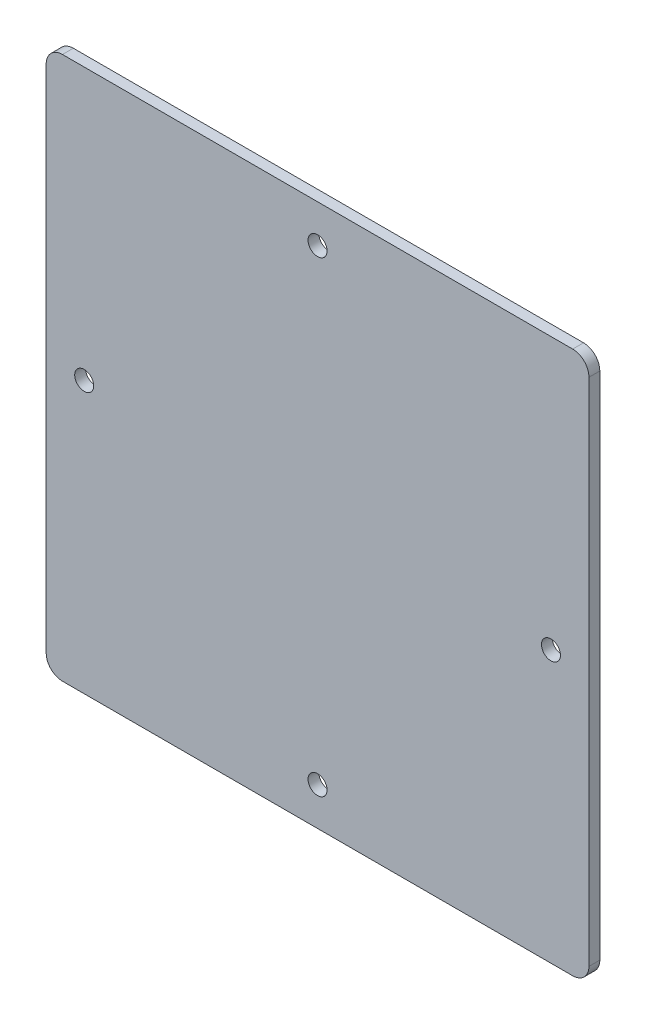
ISO-10303-21;
HEADER;
FILE_DESCRIPTION(('STEP AP214'),'2;1');
FILE_NAME('part.step','',(''),(''),'','','');
FILE_SCHEMA(('AUTOMOTIVE_DESIGN { 1 0 10303 214 1 1 1 1 }'));
ENDSEC;
DATA;
#1=APPLICATION_CONTEXT('core data for automotive mechanical design processes');
#2=APPLICATION_PROTOCOL_DEFINITION('international standard','automotive_design',2000,#1);
#3=PRODUCT_CONTEXT('',#1,'mechanical');
#4=PRODUCT('Part','Part','',(#3));
#5=PRODUCT_RELATED_PRODUCT_CATEGORY('part','',(#4));
#6=PRODUCT_DEFINITION_FORMATION('','',#4);
#7=PRODUCT_DEFINITION_CONTEXT('part definition',#1,'design');
#8=PRODUCT_DEFINITION('design','',#6,#7);
#9=PRODUCT_DEFINITION_SHAPE('','',#8);
#10=(LENGTH_UNIT() NAMED_UNIT(*) SI_UNIT(.MILLI.,.METRE.));
#11=(NAMED_UNIT(*) PLANE_ANGLE_UNIT() SI_UNIT($,.RADIAN.));
#12=(NAMED_UNIT(*) SI_UNIT($,.STERADIAN.) SOLID_ANGLE_UNIT());
#13=UNCERTAINTY_MEASURE_WITH_UNIT(LENGTH_MEASURE(1.E-05),#10,'distance_accuracy_value','');
#14=(GEOMETRIC_REPRESENTATION_CONTEXT(3) GLOBAL_UNCERTAINTY_ASSIGNED_CONTEXT((#13)) GLOBAL_UNIT_ASSIGNED_CONTEXT((#10,
#11,#12)) REPRESENTATION_CONTEXT('',''));
#15=CARTESIAN_POINT('',(0.,0.,0.));
#16=DIRECTION('',(0.,0.,1.));
#17=DIRECTION('',(1.,0.,0.));
#18=AXIS2_PLACEMENT_3D('',#15,#16,#17);
#19=CARTESIAN_POINT('',(-47.,-47.,2.));
#20=DIRECTION('',(0.,0.,1.));
#21=DIRECTION('',(1.,0.,0.));
#22=AXIS2_PLACEMENT_3D('',#19,#20,#21);
#23=PLANE('',#22);
#24=CARTESIAN_POINT('',(43.,0.,2.));
#25=DIRECTION('',(0.,0.,1.));
#26=DIRECTION('',(1.,0.,0.));
#27=AXIS2_PLACEMENT_3D('',#24,#25,#26);
#28=CIRCLE('',#27,1.75);
#29=CARTESIAN_POINT('',(44.75,0.,2.));
#30=VERTEX_POINT('',#29);
#31=EDGE_CURVE('E187',#30,#30,#28,.T.);
#32=ORIENTED_EDGE('',*,*,#31,.F.);
#33=EDGE_LOOP('',(#32));
#34=FACE_BOUND('',#33,.T.);
#35=CARTESIAN_POINT('',(-43.,0.,2.));
#36=DIRECTION('',(0.,0.,1.));
#37=DIRECTION('',(1.,0.,0.));
#38=AXIS2_PLACEMENT_3D('',#35,#36,#37);
#39=CIRCLE('',#38,1.75);
#40=CARTESIAN_POINT('',(-41.25,0.,2.));
#41=VERTEX_POINT('',#40);
#42=EDGE_CURVE('E133',#41,#41,#39,.T.);
#43=ORIENTED_EDGE('',*,*,#42,.F.);
#44=EDGE_LOOP('',(#43));
#45=FACE_BOUND('',#44,.T.);
#46=CARTESIAN_POINT('',(-47.,-47.,2.));
#47=DIRECTION('',(0.,0.,1.));
#48=DIRECTION('',(1.,0.,0.));
#49=AXIS2_PLACEMENT_3D('',#46,#47,#48);
#50=CIRCLE('',#49,3.);
#51=CARTESIAN_POINT('',(-50.,-47.,2.));
#52=VERTEX_POINT('',#51);
#53=CARTESIAN_POINT('',(-47.,-50.,2.));
#54=VERTEX_POINT('',#53);
#55=EDGE_CURVE('E144',#52,#54,#50,.T.);
#56=ORIENTED_EDGE('',*,*,#55,.T.);
#57=DIRECTION('',(1.,0.,0.));
#58=VECTOR('',#57,1.);
#59=CARTESIAN_POINT('',(-47.,-50.,2.));
#60=LINE('',#59,#58);
#61=CARTESIAN_POINT('',(47.,-50.,2.));
#62=VERTEX_POINT('',#61);
#63=EDGE_CURVE('E92',#54,#62,#60,.T.);
#64=ORIENTED_EDGE('',*,*,#63,.T.);
#65=CARTESIAN_POINT('',(47.,-47.,2.));
#66=DIRECTION('',(0.,0.,1.));
#67=DIRECTION('',(1.,0.,0.));
#68=AXIS2_PLACEMENT_3D('',#65,#66,#67);
#69=CIRCLE('',#68,3.);
#70=CARTESIAN_POINT('',(50.,-47.,2.));
#71=VERTEX_POINT('',#70);
#72=EDGE_CURVE('E159',#62,#71,#69,.T.);
#73=ORIENTED_EDGE('',*,*,#72,.T.);
#74=DIRECTION('',(0.,1.,0.));
#75=VECTOR('',#74,1.);
#76=CARTESIAN_POINT('',(50.,47.,2.));
#77=LINE('',#76,#75);
#78=CARTESIAN_POINT('',(50.,47.,2.));
#79=VERTEX_POINT('',#78);
#80=EDGE_CURVE('E172',#71,#79,#77,.T.);
#81=ORIENTED_EDGE('',*,*,#80,.T.);
#82=CARTESIAN_POINT('',(47.,47.,2.));
#83=DIRECTION('',(0.,0.,1.));
#84=DIRECTION('',(-1.,0.,0.));
#85=AXIS2_PLACEMENT_3D('',#82,#83,#84);
#86=CIRCLE('',#85,3.);
#87=CARTESIAN_POINT('',(47.,50.,2.));
#88=VERTEX_POINT('',#87);
#89=EDGE_CURVE('E111',#79,#88,#86,.T.);
#90=ORIENTED_EDGE('',*,*,#89,.T.);
#91=DIRECTION('',(-1.,0.,0.));
#92=VECTOR('',#91,1.);
#93=CARTESIAN_POINT('',(-47.,50.,2.));
#94=LINE('',#93,#92);
#95=CARTESIAN_POINT('',(-47.,50.,2.));
#96=VERTEX_POINT('',#95);
#97=EDGE_CURVE('E105',#88,#96,#94,.T.);
#98=ORIENTED_EDGE('',*,*,#97,.T.);
#99=CARTESIAN_POINT('',(-47.,47.,2.));
#100=DIRECTION('',(0.,0.,1.));
#101=DIRECTION('',(1.,0.,0.));
#102=AXIS2_PLACEMENT_3D('',#99,#100,#101);
#103=CIRCLE('',#102,3.);
#104=CARTESIAN_POINT('',(-50.,47.,2.));
#105=VERTEX_POINT('',#104);
#106=EDGE_CURVE('E109',#96,#105,#103,.T.);
#107=ORIENTED_EDGE('',*,*,#106,.T.);
#108=DIRECTION('',(0.,-1.,0.));
#109=VECTOR('',#108,1.);
#110=CARTESIAN_POINT('',(-50.,47.,2.));
#111=LINE('',#110,#109);
#112=EDGE_CURVE('E49',#105,#52,#111,.T.);
#113=ORIENTED_EDGE('',*,*,#112,.T.);
#114=EDGE_LOOP('',(#56,#64,#73,#81,#90,#98,#107,#113));
#115=FACE_BOUND('',#114,.T.);
#116=CARTESIAN_POINT('',(0.,43.,2.));
#117=DIRECTION('',(0.,0.,1.));
#118=DIRECTION('',(1.,0.,0.));
#119=AXIS2_PLACEMENT_3D('',#116,#117,#118);
#120=CIRCLE('',#119,1.75);
#121=CARTESIAN_POINT('',(1.75,43.,2.));
#122=VERTEX_POINT('',#121);
#123=EDGE_CURVE('E181',#122,#122,#120,.T.);
#124=ORIENTED_EDGE('',*,*,#123,.F.);
#125=EDGE_LOOP('',(#124));
#126=FACE_BOUND('',#125,.T.);
#127=CARTESIAN_POINT('',(0.,-43.,2.));
#128=DIRECTION('',(0.,0.,1.));
#129=DIRECTION('',(1.,0.,0.));
#130=AXIS2_PLACEMENT_3D('',#127,#128,#129);
#131=CIRCLE('',#130,1.75);
#132=CARTESIAN_POINT('',(1.75,-43.,2.));
#133=VERTEX_POINT('',#132);
#134=EDGE_CURVE('E193',#133,#133,#131,.T.);
#135=ORIENTED_EDGE('',*,*,#134,.F.);
#136=EDGE_LOOP('',(#135));
#137=FACE_BOUND('',#136,.T.);
#138=ADVANCED_FACE('F32',(#34,#45,#115,#126,#137),#23,.T.);
#139=CARTESIAN_POINT('',(-47.,-47.,0.));
#140=DIRECTION('',(0.,0.,1.));
#141=DIRECTION('',(1.,0.,0.));
#142=AXIS2_PLACEMENT_3D('',#139,#140,#141);
#143=PLANE('',#142);
#144=CARTESIAN_POINT('',(-47.,-47.,0.));
#145=DIRECTION('',(0.,0.,1.));
#146=DIRECTION('',(1.,0.,0.));
#147=AXIS2_PLACEMENT_3D('',#144,#145,#146);
#148=CIRCLE('',#147,3.);
#149=CARTESIAN_POINT('',(-50.,-47.,0.));
#150=VERTEX_POINT('',#149);
#151=CARTESIAN_POINT('',(-47.,-50.,0.));
#152=VERTEX_POINT('',#151);
#153=EDGE_CURVE('E129',#150,#152,#148,.T.);
#154=ORIENTED_EDGE('',*,*,#153,.F.);
#155=DIRECTION('',(0.,-1.,0.));
#156=VECTOR('',#155,1.);
#157=CARTESIAN_POINT('',(-50.,47.,0.));
#158=LINE('',#157,#156);
#159=CARTESIAN_POINT('',(-50.,47.,0.));
#160=VERTEX_POINT('',#159);
#161=EDGE_CURVE('E84',#160,#150,#158,.T.);
#162=ORIENTED_EDGE('',*,*,#161,.F.);
#163=CARTESIAN_POINT('',(-47.,47.,0.));
#164=DIRECTION('',(0.,0.,1.));
#165=DIRECTION('',(1.,0.,0.));
#166=AXIS2_PLACEMENT_3D('',#163,#164,#165);
#167=CIRCLE('',#166,3.);
#168=CARTESIAN_POINT('',(-47.,50.,0.));
#169=VERTEX_POINT('',#168);
#170=EDGE_CURVE('E78',#169,#160,#167,.T.);
#171=ORIENTED_EDGE('',*,*,#170,.F.);
#172=DIRECTION('',(-1.,0.,0.));
#173=VECTOR('',#172,1.);
#174=CARTESIAN_POINT('',(-47.,50.,0.));
#175=LINE('',#174,#173);
#176=CARTESIAN_POINT('',(47.,50.,0.));
#177=VERTEX_POINT('',#176);
#178=EDGE_CURVE('E119',#177,#169,#175,.T.);
#179=ORIENTED_EDGE('',*,*,#178,.F.);
#180=CARTESIAN_POINT('',(47.,47.,0.));
#181=DIRECTION('',(0.,0.,1.));
#182=DIRECTION('',(-1.,0.,0.));
#183=AXIS2_PLACEMENT_3D('',#180,#181,#182);
#184=CIRCLE('',#183,3.);
#185=CARTESIAN_POINT('',(50.,47.,0.));
#186=VERTEX_POINT('',#185);
#187=EDGE_CURVE('E139',#186,#177,#184,.T.);
#188=ORIENTED_EDGE('',*,*,#187,.F.);
#189=DIRECTION('',(0.,1.,0.));
#190=VECTOR('',#189,1.);
#191=CARTESIAN_POINT('',(50.,47.,0.));
#192=LINE('',#191,#190);
#193=CARTESIAN_POINT('',(50.,-47.,0.));
#194=VERTEX_POINT('',#193);
#195=EDGE_CURVE('E137',#194,#186,#192,.T.);
#196=ORIENTED_EDGE('',*,*,#195,.F.);
#197=CARTESIAN_POINT('',(47.,-47.,0.));
#198=DIRECTION('',(0.,0.,1.));
#199=DIRECTION('',(1.,0.,0.));
#200=AXIS2_PLACEMENT_3D('',#197,#198,#199);
#201=CIRCLE('',#200,3.);
#202=CARTESIAN_POINT('',(47.,-50.,0.));
#203=VERTEX_POINT('',#202);
#204=EDGE_CURVE('E135',#203,#194,#201,.T.);
#205=ORIENTED_EDGE('',*,*,#204,.F.);
#206=DIRECTION('',(1.,0.,0.));
#207=VECTOR('',#206,1.);
#208=CARTESIAN_POINT('',(-47.,-50.,0.));
#209=LINE('',#208,#207);
#210=EDGE_CURVE('E132',#152,#203,#209,.T.);
#211=ORIENTED_EDGE('',*,*,#210,.F.);
#212=EDGE_LOOP('',(#154,#162,#171,#179,#188,#196,#205,#211));
#213=FACE_BOUND('',#212,.T.);
#214=CARTESIAN_POINT('',(-43.,0.,0.));
#215=DIRECTION('',(0.,0.,1.));
#216=DIRECTION('',(1.,0.,0.));
#217=AXIS2_PLACEMENT_3D('',#214,#215,#216);
#218=CIRCLE('',#217,1.75);
#219=CARTESIAN_POINT('',(-41.25,0.,0.));
#220=VERTEX_POINT('',#219);
#221=EDGE_CURVE('E178',#220,#220,#218,.T.);
#222=ORIENTED_EDGE('',*,*,#221,.T.);
#223=EDGE_LOOP('',(#222));
#224=FACE_BOUND('',#223,.T.);
#225=CARTESIAN_POINT('',(0.,43.,0.));
#226=DIRECTION('',(0.,0.,1.));
#227=DIRECTION('',(1.,0.,0.));
#228=AXIS2_PLACEMENT_3D('',#225,#226,#227);
#229=CIRCLE('',#228,1.75);
#230=CARTESIAN_POINT('',(1.75,43.,0.));
#231=VERTEX_POINT('',#230);
#232=EDGE_CURVE('E184',#231,#231,#229,.T.);
#233=ORIENTED_EDGE('',*,*,#232,.T.);
#234=EDGE_LOOP('',(#233));
#235=FACE_BOUND('',#234,.T.);
#236=CARTESIAN_POINT('',(43.,0.,0.));
#237=DIRECTION('',(0.,0.,1.));
#238=DIRECTION('',(1.,0.,0.));
#239=AXIS2_PLACEMENT_3D('',#236,#237,#238);
#240=CIRCLE('',#239,1.75);
#241=CARTESIAN_POINT('',(44.75,0.,0.));
#242=VERTEX_POINT('',#241);
#243=EDGE_CURVE('E190',#242,#242,#240,.T.);
#244=ORIENTED_EDGE('',*,*,#243,.T.);
#245=EDGE_LOOP('',(#244));
#246=FACE_BOUND('',#245,.T.);
#247=CARTESIAN_POINT('',(0.,-43.,0.));
#248=DIRECTION('',(0.,0.,1.));
#249=DIRECTION('',(1.,0.,0.));
#250=AXIS2_PLACEMENT_3D('',#247,#248,#249);
#251=CIRCLE('',#250,1.75);
#252=CARTESIAN_POINT('',(1.75,-43.,0.));
#253=VERTEX_POINT('',#252);
#254=EDGE_CURVE('E196',#253,#253,#251,.T.);
#255=ORIENTED_EDGE('',*,*,#254,.T.);
#256=EDGE_LOOP('',(#255));
#257=FACE_BOUND('',#256,.T.);
#258=ADVANCED_FACE('F163',(#213,#224,#235,#246,#257),#143,.F.);
#259=CARTESIAN_POINT('',(-47.,-47.,2.));
#260=DIRECTION('',(0.,0.,-1.));
#261=DIRECTION('',(-1.,0.,0.));
#262=AXIS2_PLACEMENT_3D('',#259,#260,#261);
#263=CYLINDRICAL_SURFACE('',#262,3.);
#264=ORIENTED_EDGE('',*,*,#153,.T.);
#265=DIRECTION('',(0.,0.,-1.));
#266=VECTOR('',#265,1.);
#267=CARTESIAN_POINT('',(-47.,-50.,2.));
#268=LINE('',#267,#266);
#269=EDGE_CURVE('E11',#54,#152,#268,.T.);
#270=ORIENTED_EDGE('',*,*,#269,.F.);
#271=ORIENTED_EDGE('',*,*,#55,.F.);
#272=DIRECTION('',(0.,0.,-1.));
#273=VECTOR('',#272,1.);
#274=CARTESIAN_POINT('',(-50.,-47.,2.));
#275=LINE('',#274,#273);
#276=EDGE_CURVE('E125',#52,#150,#275,.T.);
#277=ORIENTED_EDGE('',*,*,#276,.T.);
#278=EDGE_LOOP('',(#264,#270,#271,#277));
#279=FACE_BOUND('',#278,.T.);
#280=ADVANCED_FACE('F34',(#279),#263,.T.);
#281=CARTESIAN_POINT('',(-47.,-50.,2.));
#282=DIRECTION('',(0.,1.,0.));
#283=DIRECTION('',(0.,0.,1.));
#284=AXIS2_PLACEMENT_3D('',#281,#282,#283);
#285=PLANE('',#284);
#286=ORIENTED_EDGE('',*,*,#210,.T.);
#287=DIRECTION('',(0.,0.,-1.));
#288=VECTOR('',#287,1.);
#289=CARTESIAN_POINT('',(47.,-50.,2.));
#290=LINE('',#289,#288);
#291=EDGE_CURVE('E41',#62,#203,#290,.T.);
#292=ORIENTED_EDGE('',*,*,#291,.F.);
#293=ORIENTED_EDGE('',*,*,#63,.F.);
#294=ORIENTED_EDGE('',*,*,#269,.T.);
#295=EDGE_LOOP('',(#286,#292,#293,#294));
#296=FACE_BOUND('',#295,.T.);
#297=ADVANCED_FACE('F230',(#296),#285,.F.);
#298=CARTESIAN_POINT('',(47.,-47.,2.));
#299=DIRECTION('',(0.,0.,-1.));
#300=DIRECTION('',(-1.,0.,0.));
#301=AXIS2_PLACEMENT_3D('',#298,#299,#300);
#302=CYLINDRICAL_SURFACE('',#301,3.);
#303=ORIENTED_EDGE('',*,*,#204,.T.);
#304=DIRECTION('',(0.,0.,-1.));
#305=VECTOR('',#304,1.);
#306=CARTESIAN_POINT('',(50.,-47.,2.));
#307=LINE('',#306,#305);
#308=EDGE_CURVE('E151',#71,#194,#307,.T.);
#309=ORIENTED_EDGE('',*,*,#308,.F.);
#310=ORIENTED_EDGE('',*,*,#72,.F.);
#311=ORIENTED_EDGE('',*,*,#291,.T.);
#312=EDGE_LOOP('',(#303,#309,#310,#311));
#313=FACE_BOUND('',#312,.T.);
#314=ADVANCED_FACE('F157',(#313),#302,.T.);
#315=CARTESIAN_POINT('',(50.,47.,2.));
#316=DIRECTION('',(-1.,0.,0.));
#317=DIRECTION('',(0.,-1.,0.));
#318=AXIS2_PLACEMENT_3D('',#315,#316,#317);
#319=PLANE('',#318);
#320=ORIENTED_EDGE('',*,*,#195,.T.);
#321=DIRECTION('',(0.,0.,-1.));
#322=VECTOR('',#321,1.);
#323=CARTESIAN_POINT('',(50.,47.,2.));
#324=LINE('',#323,#322);
#325=EDGE_CURVE('E148',#79,#186,#324,.T.);
#326=ORIENTED_EDGE('',*,*,#325,.F.);
#327=ORIENTED_EDGE('',*,*,#80,.F.);
#328=ORIENTED_EDGE('',*,*,#308,.T.);
#329=EDGE_LOOP('',(#320,#326,#327,#328));
#330=FACE_BOUND('',#329,.T.);
#331=ADVANCED_FACE('F168',(#330),#319,.F.);
#332=CARTESIAN_POINT('',(47.,47.,2.));
#333=DIRECTION('',(0.,0.,-1.));
#334=DIRECTION('',(-1.,0.,0.));
#335=AXIS2_PLACEMENT_3D('',#332,#333,#334);
#336=CYLINDRICAL_SURFACE('',#335,3.);
#337=ORIENTED_EDGE('',*,*,#187,.T.);
#338=DIRECTION('',(0.,0.,-1.));
#339=VECTOR('',#338,1.);
#340=CARTESIAN_POINT('',(47.,50.,2.));
#341=LINE('',#340,#339);
#342=EDGE_CURVE('E120',#88,#177,#341,.T.);
#343=ORIENTED_EDGE('',*,*,#342,.F.);
#344=ORIENTED_EDGE('',*,*,#89,.F.);
#345=ORIENTED_EDGE('',*,*,#325,.T.);
#346=EDGE_LOOP('',(#337,#343,#344,#345));
#347=FACE_BOUND('',#346,.T.);
#348=ADVANCED_FACE('F171',(#347),#336,.T.);
#349=CARTESIAN_POINT('',(-47.,50.,2.));
#350=DIRECTION('',(0.,-1.,0.));
#351=DIRECTION('',(0.,0.,-1.));
#352=AXIS2_PLACEMENT_3D('',#349,#350,#351);
#353=PLANE('',#352);
#354=ORIENTED_EDGE('',*,*,#178,.T.);
#355=DIRECTION('',(0.,0.,-1.));
#356=VECTOR('',#355,1.);
#357=CARTESIAN_POINT('',(-47.,50.,2.));
#358=LINE('',#357,#356);
#359=EDGE_CURVE('E116',#96,#169,#358,.T.);
#360=ORIENTED_EDGE('',*,*,#359,.F.);
#361=ORIENTED_EDGE('',*,*,#97,.F.);
#362=ORIENTED_EDGE('',*,*,#342,.T.);
#363=EDGE_LOOP('',(#354,#360,#361,#362));
#364=FACE_BOUND('',#363,.T.);
#365=ADVANCED_FACE('F117',(#364),#353,.F.);
#366=CARTESIAN_POINT('',(-47.,47.,2.));
#367=DIRECTION('',(0.,0.,-1.));
#368=DIRECTION('',(-1.,0.,0.));
#369=AXIS2_PLACEMENT_3D('',#366,#367,#368);
#370=CYLINDRICAL_SURFACE('',#369,3.);
#371=ORIENTED_EDGE('',*,*,#170,.T.);
#372=DIRECTION('',(0.,0.,-1.));
#373=VECTOR('',#372,1.);
#374=CARTESIAN_POINT('',(-50.,47.,2.));
#375=LINE('',#374,#373);
#376=EDGE_CURVE('E121',#105,#160,#375,.T.);
#377=ORIENTED_EDGE('',*,*,#376,.F.);
#378=ORIENTED_EDGE('',*,*,#106,.F.);
#379=ORIENTED_EDGE('',*,*,#359,.T.);
#380=EDGE_LOOP('',(#371,#377,#378,#379));
#381=FACE_BOUND('',#380,.T.);
#382=ADVANCED_FACE('F123',(#381),#370,.T.);
#383=CARTESIAN_POINT('',(-50.,47.,2.));
#384=DIRECTION('',(1.,0.,0.));
#385=DIRECTION('',(0.,1.,0.));
#386=AXIS2_PLACEMENT_3D('',#383,#384,#385);
#387=PLANE('',#386);
#388=ORIENTED_EDGE('',*,*,#161,.T.);
#389=ORIENTED_EDGE('',*,*,#276,.F.);
#390=ORIENTED_EDGE('',*,*,#112,.F.);
#391=ORIENTED_EDGE('',*,*,#376,.T.);
#392=EDGE_LOOP('',(#388,#389,#390,#391));
#393=FACE_BOUND('',#392,.T.);
#394=ADVANCED_FACE('F218',(#393),#387,.F.);
#395=CARTESIAN_POINT('',(-43.,0.,2.));
#396=DIRECTION('',(0.,0.,-1.));
#397=DIRECTION('',(-1.,0.,0.));
#398=AXIS2_PLACEMENT_3D('',#395,#396,#397);
#399=CYLINDRICAL_SURFACE('',#398,1.75);
#400=ORIENTED_EDGE('',*,*,#42,.T.);
#401=EDGE_LOOP('',(#400));
#402=FACE_BOUND('',#401,.T.);
#403=ORIENTED_EDGE('',*,*,#221,.F.);
#404=EDGE_LOOP('',(#403));
#405=FACE_BOUND('',#404,.T.);
#406=ADVANCED_FACE('F215',(#402,#405),#399,.F.);
#407=CARTESIAN_POINT('',(0.,43.,2.));
#408=DIRECTION('',(0.,0.,-1.));
#409=DIRECTION('',(-1.,0.,0.));
#410=AXIS2_PLACEMENT_3D('',#407,#408,#409);
#411=CYLINDRICAL_SURFACE('',#410,1.75);
#412=ORIENTED_EDGE('',*,*,#123,.T.);
#413=EDGE_LOOP('',(#412));
#414=FACE_BOUND('',#413,.T.);
#415=ORIENTED_EDGE('',*,*,#232,.F.);
#416=EDGE_LOOP('',(#415));
#417=FACE_BOUND('',#416,.T.);
#418=ADVANCED_FACE('F294',(#414,#417),#411,.F.);
#419=CARTESIAN_POINT('',(43.,0.,2.));
#420=DIRECTION('',(0.,0.,-1.));
#421=DIRECTION('',(-1.,0.,0.));
#422=AXIS2_PLACEMENT_3D('',#419,#420,#421);
#423=CYLINDRICAL_SURFACE('',#422,1.75);
#424=ORIENTED_EDGE('',*,*,#31,.T.);
#425=EDGE_LOOP('',(#424));
#426=FACE_BOUND('',#425,.T.);
#427=ORIENTED_EDGE('',*,*,#243,.F.);
#428=EDGE_LOOP('',(#427));
#429=FACE_BOUND('',#428,.T.);
#430=ADVANCED_FACE('F302',(#426,#429),#423,.F.);
#431=CARTESIAN_POINT('',(0.,-43.,2.));
#432=DIRECTION('',(0.,0.,-1.));
#433=DIRECTION('',(-1.,0.,0.));
#434=AXIS2_PLACEMENT_3D('',#431,#432,#433);
#435=CYLINDRICAL_SURFACE('',#434,1.75);
#436=ORIENTED_EDGE('',*,*,#134,.T.);
#437=EDGE_LOOP('',(#436));
#438=FACE_BOUND('',#437,.T.);
#439=ORIENTED_EDGE('',*,*,#254,.F.);
#440=EDGE_LOOP('',(#439));
#441=FACE_BOUND('',#440,.T.);
#442=ADVANCED_FACE('F202',(#438,#441),#435,.F.);
#443=CLOSED_SHELL('',(#138,#258,#280,#297,#314,#331,#348,#365,#382,#394,#406,#418,#430,#442));
#444=MANIFOLD_SOLID_BREP('B2',#443);
#445=ADVANCED_BREP_SHAPE_REPRESENTATION('',(#18,#444),#14);
#446=SHAPE_DEFINITION_REPRESENTATION(#9,#445);
ENDSEC;
END-ISO-10303-21;
